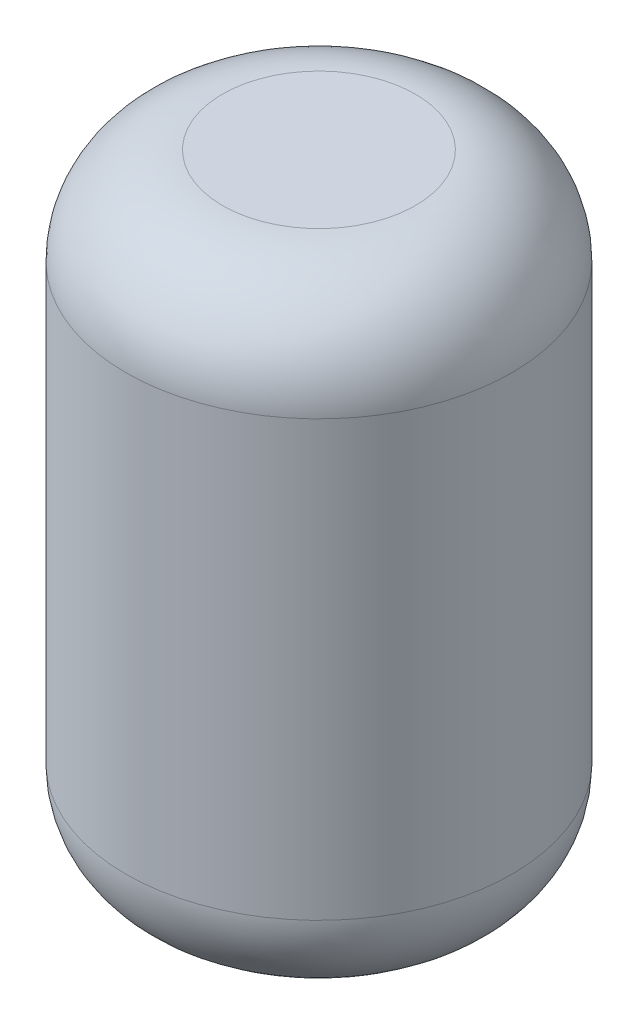
ISO-10303-21;
HEADER;
FILE_DESCRIPTION(('STEP AP214'),'2;1');
FILE_NAME('part.step','',(''),(''),'','','');
FILE_SCHEMA(('AUTOMOTIVE_DESIGN { 1 0 10303 214 1 1 1 1 }'));
ENDSEC;
DATA;
#1=APPLICATION_CONTEXT('core data for automotive mechanical design processes');
#2=APPLICATION_PROTOCOL_DEFINITION('international standard','automotive_design',2000,#1);
#3=PRODUCT_CONTEXT('',#1,'mechanical');
#4=PRODUCT('Part','Part','',(#3));
#5=PRODUCT_RELATED_PRODUCT_CATEGORY('part','',(#4));
#6=PRODUCT_DEFINITION_FORMATION('','',#4);
#7=PRODUCT_DEFINITION_CONTEXT('part definition',#1,'design');
#8=PRODUCT_DEFINITION('design','',#6,#7);
#9=PRODUCT_DEFINITION_SHAPE('','',#8);
#10=(LENGTH_UNIT() NAMED_UNIT(*) SI_UNIT(.MILLI.,.METRE.));
#11=(NAMED_UNIT(*) PLANE_ANGLE_UNIT() SI_UNIT($,.RADIAN.));
#12=(NAMED_UNIT(*) SI_UNIT($,.STERADIAN.) SOLID_ANGLE_UNIT());
#13=UNCERTAINTY_MEASURE_WITH_UNIT(LENGTH_MEASURE(1.E-05),#10,'distance_accuracy_value','');
#14=(GEOMETRIC_REPRESENTATION_CONTEXT(3) GLOBAL_UNCERTAINTY_ASSIGNED_CONTEXT((#13)) GLOBAL_UNIT_ASSIGNED_CONTEXT((#10,
#11,#12)) REPRESENTATION_CONTEXT('',''));
#15=CARTESIAN_POINT('',(0.,0.,0.));
#16=DIRECTION('',(0.,0.,1.));
#17=DIRECTION('',(1.,0.,0.));
#18=AXIS2_PLACEMENT_3D('',#15,#16,#17);
#19=CARTESIAN_POINT('',(0.,165.1,0.));
#20=DIRECTION('',(0.,-1.,0.));
#21=DIRECTION('',(0.,0.,-1.));
#22=AXIS2_PLACEMENT_3D('',#19,#20,#21);
#23=CYLINDRICAL_SURFACE('',#22,50.8);
#24=CARTESIAN_POINT('',(0.,25.4,0.));
#25=DIRECTION('',(0.,1.,0.));
#26=DIRECTION('',(0.,0.,1.));
#27=AXIS2_PLACEMENT_3D('',#24,#25,#26);
#28=CIRCLE('',#27,50.8);
#29=CARTESIAN_POINT('',(0.,25.4,50.8));
#30=VERTEX_POINT('',#29);
#31=EDGE_CURVE('E45',#30,#30,#28,.T.);
#32=ORIENTED_EDGE('',*,*,#31,.T.);
#33=EDGE_LOOP('',(#32));
#34=FACE_BOUND('',#33,.T.);
#35=CARTESIAN_POINT('',(0.,139.7,0.));
#36=DIRECTION('',(0.,1.,0.));
#37=DIRECTION('',(0.,0.,1.));
#38=AXIS2_PLACEMENT_3D('',#35,#36,#37);
#39=CIRCLE('',#38,50.8);
#40=CARTESIAN_POINT('',(0.,139.7,50.8));
#41=VERTEX_POINT('',#40);
#42=EDGE_CURVE('E50',#41,#41,#39,.F.);
#43=ORIENTED_EDGE('',*,*,#42,.T.);
#44=EDGE_LOOP('',(#43));
#45=FACE_BOUND('',#44,.T.);
#46=ADVANCED_FACE('F37',(#34,#45),#23,.T.);
#47=CARTESIAN_POINT('',(0.,165.1,0.));
#48=DIRECTION('',(0.,1.,0.));
#49=DIRECTION('',(0.,0.,1.));
#50=AXIS2_PLACEMENT_3D('',#47,#48,#49);
#51=PLANE('',#50);
#52=CARTESIAN_POINT('',(0.,165.1,0.));
#53=DIRECTION('',(0.,1.,0.));
#54=DIRECTION('',(0.,0.,1.));
#55=AXIS2_PLACEMENT_3D('',#52,#53,#54);
#56=CIRCLE('',#55,25.4);
#57=CARTESIAN_POINT('',(0.,165.1,25.4));
#58=VERTEX_POINT('',#57);
#59=EDGE_CURVE('E55',#58,#58,#56,.T.);
#60=ORIENTED_EDGE('',*,*,#59,.T.);
#61=EDGE_LOOP('',(#60));
#62=FACE_BOUND('',#61,.T.);
#63=ADVANCED_FACE('F62',(#62),#51,.T.);
#64=CARTESIAN_POINT('',(0.,0.,0.));
#65=DIRECTION('',(0.,1.,0.));
#66=DIRECTION('',(0.,0.,1.));
#67=AXIS2_PLACEMENT_3D('',#64,#65,#66);
#68=PLANE('',#67);
#69=CARTESIAN_POINT('',(0.,0.,0.));
#70=DIRECTION('',(0.,1.,0.));
#71=DIRECTION('',(0.,0.,1.));
#72=AXIS2_PLACEMENT_3D('',#69,#70,#71);
#73=CIRCLE('',#72,25.4);
#74=CARTESIAN_POINT('',(0.,0.,25.4));
#75=VERTEX_POINT('',#74);
#76=EDGE_CURVE('E10',#75,#75,#73,.F.);
#77=ORIENTED_EDGE('',*,*,#76,.T.);
#78=EDGE_LOOP('',(#77));
#79=FACE_BOUND('',#78,.T.);
#80=ADVANCED_FACE('F66',(#79),#68,.F.);
#81=CARTESIAN_POINT('',(0.,139.7,0.));
#82=DIRECTION('',(0.,1.,0.));
#83=DIRECTION('',(0.,0.,1.));
#84=AXIS2_PLACEMENT_3D('',#81,#82,#83);
#85=DEGENERATE_TOROIDAL_SURFACE('',#84,25.4,25.4,.T.);
#86=ORIENTED_EDGE('',*,*,#42,.F.);
#87=EDGE_LOOP('',(#86));
#88=FACE_BOUND('',#87,.T.);
#89=ORIENTED_EDGE('',*,*,#59,.F.);
#90=EDGE_LOOP('',(#89));
#91=FACE_BOUND('',#90,.T.);
#92=ADVANCED_FACE('F64',(#88,#91),#85,.T.);
#93=CARTESIAN_POINT('',(0.,25.4,0.));
#94=DIRECTION('',(0.,1.,0.));
#95=DIRECTION('',(0.,0.,1.));
#96=AXIS2_PLACEMENT_3D('',#93,#94,#95);
#97=DEGENERATE_TOROIDAL_SURFACE('',#96,25.4,25.4,.T.);
#98=ORIENTED_EDGE('',*,*,#76,.F.);
#99=EDGE_LOOP('',(#98));
#100=FACE_BOUND('',#99,.T.);
#101=ORIENTED_EDGE('',*,*,#31,.F.);
#102=EDGE_LOOP('',(#101));
#103=FACE_BOUND('',#102,.T.);
#104=ADVANCED_FACE('F39',(#100,#103),#97,.T.);
#105=CLOSED_SHELL('',(#46,#63,#80,#92,#104));
#106=MANIFOLD_SOLID_BREP('B2',#105);
#107=ADVANCED_BREP_SHAPE_REPRESENTATION('',(#18,#106),#14);
#108=SHAPE_DEFINITION_REPRESENTATION(#9,#107);
ENDSEC;
END-ISO-10303-21;
